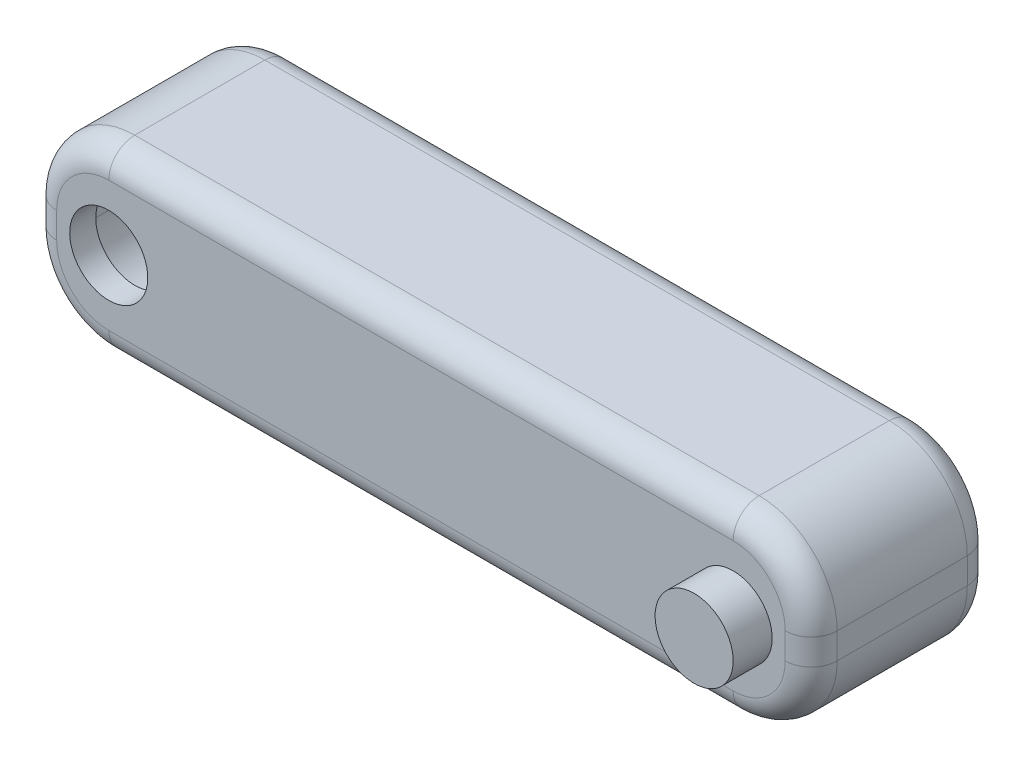
ISO-10303-21;
HEADER;
FILE_DESCRIPTION(('STEP AP214'),'2;1');
FILE_NAME('part.step','',(''),(''),'','','');
FILE_SCHEMA(('AUTOMOTIVE_DESIGN { 1 0 10303 214 1 1 1 1 }'));
ENDSEC;
DATA;
#1=APPLICATION_CONTEXT('core data for automotive mechanical design processes');
#2=APPLICATION_PROTOCOL_DEFINITION('international standard','automotive_design',2000,#1);
#3=PRODUCT_CONTEXT('',#1,'mechanical');
#4=PRODUCT('Part','Part','',(#3));
#5=PRODUCT_RELATED_PRODUCT_CATEGORY('part','',(#4));
#6=PRODUCT_DEFINITION_FORMATION('','',#4);
#7=PRODUCT_DEFINITION_CONTEXT('part definition',#1,'design');
#8=PRODUCT_DEFINITION('design','',#6,#7);
#9=PRODUCT_DEFINITION_SHAPE('','',#8);
#10=(LENGTH_UNIT() NAMED_UNIT(*) SI_UNIT(.MILLI.,.METRE.));
#11=(NAMED_UNIT(*) PLANE_ANGLE_UNIT() SI_UNIT($,.RADIAN.));
#12=(NAMED_UNIT(*) SI_UNIT($,.STERADIAN.) SOLID_ANGLE_UNIT());
#13=UNCERTAINTY_MEASURE_WITH_UNIT(LENGTH_MEASURE(1.E-05),#10,'distance_accuracy_value','');
#14=(GEOMETRIC_REPRESENTATION_CONTEXT(3) GLOBAL_UNCERTAINTY_ASSIGNED_CONTEXT((#13)) GLOBAL_UNIT_ASSIGNED_CONTEXT((#10,
#11,#12)) REPRESENTATION_CONTEXT('',''));
#15=CARTESIAN_POINT('',(0.,0.,0.));
#16=DIRECTION('',(0.,0.,1.));
#17=DIRECTION('',(1.,0.,0.));
#18=AXIS2_PLACEMENT_3D('',#15,#16,#17);
#19=CARTESIAN_POINT('',(300.,35.,35.));
#20=DIRECTION('',(0.,0.,-1.));
#21=DIRECTION('',(0.,1.,0.));
#22=AXIS2_PLACEMENT_3D('',#19,#20,#21);
#23=PLANE('',#22);
#24=CARTESIAN_POINT('',(270.,0.,35.));
#25=DIRECTION('',(0.,0.,-1.));
#26=DIRECTION('',(0.,1.,0.));
#27=AXIS2_PLACEMENT_3D('',#24,#25,#26);
#28=CIRCLE('',#27,15.);
#29=CARTESIAN_POINT('',(270.,15.,35.));
#30=VERTEX_POINT('',#29);
#31=EDGE_CURVE('E11',#30,#30,#28,.F.);
#32=ORIENTED_EDGE('',*,*,#31,.F.);
#33=EDGE_LOOP('',(#32));
#34=FACE_BOUND('',#33,.T.);
#35=CARTESIAN_POINT('',(30.,0.,35.));
#36=DIRECTION('',(0.,0.,-1.));
#37=DIRECTION('',(0.,1.,0.));
#38=AXIS2_PLACEMENT_3D('',#35,#36,#37);
#39=CIRCLE('',#38,15.);
#40=CARTESIAN_POINT('',(30.,15.,35.));
#41=VERTEX_POINT('',#40);
#42=EDGE_CURVE('E860',#41,#41,#39,.T.);
#43=ORIENTED_EDGE('',*,*,#42,.T.);
#44=EDGE_LOOP('',(#43));
#45=FACE_BOUND('',#44,.T.);
#46=DIRECTION('',(0.,-1.,0.));
#47=VECTOR('',#46,1.);
#48=CARTESIAN_POINT('',(290.,35.,35.));
#49=LINE('',#48,#47);
#50=CARTESIAN_POINT('',(290.,-5.,35.));
#51=VERTEX_POINT('',#50);
#52=CARTESIAN_POINT('',(290.,5.,35.));
#53=VERTEX_POINT('',#52);
#54=EDGE_CURVE('E111',#51,#53,#49,.F.);
#55=ORIENTED_EDGE('',*,*,#54,.T.);
#56=CARTESIAN_POINT('',(270.,5.,35.));
#57=DIRECTION('',(0.,0.,-1.));
#58=DIRECTION('',(0.,1.,0.));
#59=AXIS2_PLACEMENT_3D('',#56,#57,#58);
#60=CIRCLE('',#59,20.);
#61=CARTESIAN_POINT('',(270.,25.,35.));
#62=VERTEX_POINT('',#61);
#63=EDGE_CURVE('E293',#53,#62,#60,.F.);
#64=ORIENTED_EDGE('',*,*,#63,.T.);
#65=DIRECTION('',(-1.,0.,0.));
#66=VECTOR('',#65,1.);
#67=CARTESIAN_POINT('',(300.,25.,35.));
#68=LINE('',#67,#66);
#69=CARTESIAN_POINT('',(30.,25.,35.));
#70=VERTEX_POINT('',#69);
#71=EDGE_CURVE('E281',#62,#70,#68,.T.);
#72=ORIENTED_EDGE('',*,*,#71,.T.);
#73=CARTESIAN_POINT('',(30.,5.,35.));
#74=DIRECTION('',(0.,0.,-1.));
#75=DIRECTION('',(0.,1.,0.));
#76=AXIS2_PLACEMENT_3D('',#73,#74,#75);
#77=CIRCLE('',#76,20.);
#78=CARTESIAN_POINT('',(9.99999999999997,5.,35.));
#79=VERTEX_POINT('',#78);
#80=EDGE_CURVE('E283',#70,#79,#77,.F.);
#81=ORIENTED_EDGE('',*,*,#80,.T.);
#82=DIRECTION('',(0.,-1.,0.));
#83=VECTOR('',#82,1.);
#84=CARTESIAN_POINT('',(10.,-5.,35.));
#85=LINE('',#84,#83);
#86=CARTESIAN_POINT('',(10.,-5.,35.));
#87=VERTEX_POINT('',#86);
#88=EDGE_CURVE('E285',#79,#87,#85,.T.);
#89=ORIENTED_EDGE('',*,*,#88,.T.);
#90=CARTESIAN_POINT('',(30.,-5.,35.));
#91=DIRECTION('',(0.,0.,-1.));
#92=DIRECTION('',(0.,1.,0.));
#93=AXIS2_PLACEMENT_3D('',#90,#91,#92);
#94=CIRCLE('',#93,20.);
#95=CARTESIAN_POINT('',(30.,-25.,35.));
#96=VERTEX_POINT('',#95);
#97=EDGE_CURVE('E287',#87,#96,#94,.F.);
#98=ORIENTED_EDGE('',*,*,#97,.T.);
#99=DIRECTION('',(-1.,0.,0.));
#100=VECTOR('',#99,1.);
#101=CARTESIAN_POINT('',(300.,-25.,35.));
#102=LINE('',#101,#100);
#103=CARTESIAN_POINT('',(270.,-25.,35.));
#104=VERTEX_POINT('',#103);
#105=EDGE_CURVE('E289',#96,#104,#102,.F.);
#106=ORIENTED_EDGE('',*,*,#105,.T.);
#107=CARTESIAN_POINT('',(270.,-5.,35.));
#108=DIRECTION('',(0.,0.,-1.));
#109=DIRECTION('',(0.,1.,0.));
#110=AXIS2_PLACEMENT_3D('',#107,#108,#109);
#111=CIRCLE('',#110,20.);
#112=EDGE_CURVE('E116',#104,#51,#111,.F.);
#113=ORIENTED_EDGE('',*,*,#112,.T.);
#114=EDGE_LOOP('',(#55,#64,#72,#81,#89,#98,#106,#113));
#115=FACE_BOUND('',#114,.T.);
#116=ADVANCED_FACE('F35',(#34,#45,#115),#23,.F.);
#117=CARTESIAN_POINT('',(300.,-35.,-35.));
#118=DIRECTION('',(0.,1.,0.));
#119=DIRECTION('',(0.,0.,1.));
#120=AXIS2_PLACEMENT_3D('',#117,#118,#119);
#121=PLANE('',#120);
#122=DIRECTION('',(0.,0.,-1.));
#123=VECTOR('',#122,1.);
#124=CARTESIAN_POINT('',(30.,-35.,-35.));
#125=LINE('',#124,#123);
#126=CARTESIAN_POINT('',(30.,-35.,25.));
#127=VERTEX_POINT('',#126);
#128=CARTESIAN_POINT('',(30.,-35.,-25.));
#129=VERTEX_POINT('',#128);
#130=EDGE_CURVE('E844',#127,#129,#125,.T.);
#131=ORIENTED_EDGE('',*,*,#130,.T.);
#132=DIRECTION('',(-1.,0.,0.));
#133=VECTOR('',#132,1.);
#134=CARTESIAN_POINT('',(300.,-35.,-25.));
#135=LINE('',#134,#133);
#136=CARTESIAN_POINT('',(270.,-35.,-25.));
#137=VERTEX_POINT('',#136);
#138=EDGE_CURVE('E268',#129,#137,#135,.F.);
#139=ORIENTED_EDGE('',*,*,#138,.T.);
#140=DIRECTION('',(0.,0.,-1.));
#141=VECTOR('',#140,1.);
#142=CARTESIAN_POINT('',(270.,-35.,-35.));
#143=LINE('',#142,#141);
#144=CARTESIAN_POINT('',(270.,-35.,25.));
#145=VERTEX_POINT('',#144);
#146=EDGE_CURVE('E315',#137,#145,#143,.F.);
#147=ORIENTED_EDGE('',*,*,#146,.T.);
#148=DIRECTION('',(-1.,0.,0.));
#149=VECTOR('',#148,1.);
#150=CARTESIAN_POINT('',(300.,-35.,25.));
#151=LINE('',#150,#149);
#152=EDGE_CURVE('E266',#145,#127,#151,.T.);
#153=ORIENTED_EDGE('',*,*,#152,.T.);
#154=EDGE_LOOP('',(#131,#139,#147,#153));
#155=FACE_BOUND('',#154,.T.);
#156=ADVANCED_FACE('F432',(#155),#121,.F.);
#157=CARTESIAN_POINT('',(300.,35.,-35.));
#158=DIRECTION('',(0.,0.,1.));
#159=DIRECTION('',(0.,-1.,0.));
#160=AXIS2_PLACEMENT_3D('',#157,#158,#159);
#161=PLANE('',#160);
#162=DIRECTION('',(-1.,0.,0.));
#163=VECTOR('',#162,1.);
#164=CARTESIAN_POINT('',(300.,25.,-35.));
#165=LINE('',#164,#163);
#166=CARTESIAN_POINT('',(30.,25.,-35.));
#167=VERTEX_POINT('',#166);
#168=CARTESIAN_POINT('',(270.,25.,-35.));
#169=VERTEX_POINT('',#168);
#170=EDGE_CURVE('E213',#167,#169,#165,.F.);
#171=ORIENTED_EDGE('',*,*,#170,.T.);
#172=CARTESIAN_POINT('',(270.,5.00000000000001,-35.));
#173=DIRECTION('',(0.,0.,1.));
#174=DIRECTION('',(0.,-1.,0.));
#175=AXIS2_PLACEMENT_3D('',#172,#173,#174);
#176=CIRCLE('',#175,20.);
#177=CARTESIAN_POINT('',(290.,5.00000000000001,-35.));
#178=VERTEX_POINT('',#177);
#179=EDGE_CURVE('E250',#169,#178,#176,.F.);
#180=ORIENTED_EDGE('',*,*,#179,.T.);
#181=DIRECTION('',(0.,1.,0.));
#182=VECTOR('',#181,1.);
#183=CARTESIAN_POINT('',(290.,35.,-35.));
#184=LINE('',#183,#182);
#185=CARTESIAN_POINT('',(290.,-5.,-35.));
#186=VERTEX_POINT('',#185);
#187=EDGE_CURVE('E248',#178,#186,#184,.F.);
#188=ORIENTED_EDGE('',*,*,#187,.T.);
#189=CARTESIAN_POINT('',(270.,-5.,-35.));
#190=DIRECTION('',(0.,0.,1.));
#191=DIRECTION('',(0.,-1.,0.));
#192=AXIS2_PLACEMENT_3D('',#189,#190,#191);
#193=CIRCLE('',#192,20.);
#194=CARTESIAN_POINT('',(270.,-25.,-35.));
#195=VERTEX_POINT('',#194);
#196=EDGE_CURVE('E246',#186,#195,#193,.F.);
#197=ORIENTED_EDGE('',*,*,#196,.T.);
#198=DIRECTION('',(-1.,0.,0.));
#199=VECTOR('',#198,1.);
#200=CARTESIAN_POINT('',(300.,-25.,-35.));
#201=LINE('',#200,#199);
#202=CARTESIAN_POINT('',(30.,-25.,-35.));
#203=VERTEX_POINT('',#202);
#204=EDGE_CURVE('E244',#195,#203,#201,.T.);
#205=ORIENTED_EDGE('',*,*,#204,.T.);
#206=CARTESIAN_POINT('',(30.,-5.,-35.));
#207=DIRECTION('',(0.,0.,1.));
#208=DIRECTION('',(0.,-1.,0.));
#209=AXIS2_PLACEMENT_3D('',#206,#207,#208);
#210=CIRCLE('',#209,20.);
#211=CARTESIAN_POINT('',(10.,-5.,-35.));
#212=VERTEX_POINT('',#211);
#213=EDGE_CURVE('E242',#203,#212,#210,.F.);
#214=ORIENTED_EDGE('',*,*,#213,.T.);
#215=DIRECTION('',(0.,1.,0.));
#216=VECTOR('',#215,1.);
#217=CARTESIAN_POINT('',(10.,5.00000000000001,-35.));
#218=LINE('',#217,#216);
#219=CARTESIAN_POINT('',(9.99999999999997,5.00000000000001,-35.));
#220=VERTEX_POINT('',#219);
#221=EDGE_CURVE('E216',#212,#220,#218,.T.);
#222=ORIENTED_EDGE('',*,*,#221,.T.);
#223=CARTESIAN_POINT('',(30.,5.00000000000001,-35.));
#224=DIRECTION('',(0.,0.,1.));
#225=DIRECTION('',(0.,-1.,0.));
#226=AXIS2_PLACEMENT_3D('',#223,#224,#225);
#227=CIRCLE('',#226,20.);
#228=EDGE_CURVE('E208',#220,#167,#227,.F.);
#229=ORIENTED_EDGE('',*,*,#228,.T.);
#230=EDGE_LOOP('',(#171,#180,#188,#197,#205,#214,#222,#229));
#231=FACE_BOUND('',#230,.T.);
#232=ADVANCED_FACE('F210',(#231),#161,.F.);
#233=CARTESIAN_POINT('',(300.,35.,-35.));
#234=DIRECTION('',(0.,-1.,0.));
#235=DIRECTION('',(0.,0.,-1.));
#236=AXIS2_PLACEMENT_3D('',#233,#234,#235);
#237=PLANE('',#236);
#238=DIRECTION('',(0.,0.,1.));
#239=VECTOR('',#238,1.);
#240=CARTESIAN_POINT('',(270.,35.,-35.));
#241=LINE('',#240,#239);
#242=CARTESIAN_POINT('',(270.,35.,25.));
#243=VERTEX_POINT('',#242);
#244=CARTESIAN_POINT('',(270.,35.,-25.));
#245=VERTEX_POINT('',#244);
#246=EDGE_CURVE('E805',#243,#245,#241,.F.);
#247=ORIENTED_EDGE('',*,*,#246,.T.);
#248=DIRECTION('',(-1.,0.,0.));
#249=VECTOR('',#248,1.);
#250=CARTESIAN_POINT('',(300.,35.,-25.));
#251=LINE('',#250,#249);
#252=CARTESIAN_POINT('',(30.,35.,-25.));
#253=VERTEX_POINT('',#252);
#254=EDGE_CURVE('E297',#245,#253,#251,.T.);
#255=ORIENTED_EDGE('',*,*,#254,.T.);
#256=DIRECTION('',(0.,0.,1.));
#257=VECTOR('',#256,1.);
#258=CARTESIAN_POINT('',(30.,35.,35.));
#259=LINE('',#258,#257);
#260=CARTESIAN_POINT('',(30.,35.,25.));
#261=VERTEX_POINT('',#260);
#262=EDGE_CURVE('E810',#253,#261,#259,.T.);
#263=ORIENTED_EDGE('',*,*,#262,.T.);
#264=DIRECTION('',(-1.,0.,0.));
#265=VECTOR('',#264,1.);
#266=CARTESIAN_POINT('',(300.,35.,25.));
#267=LINE('',#266,#265);
#268=EDGE_CURVE('E295',#261,#243,#267,.F.);
#269=ORIENTED_EDGE('',*,*,#268,.T.);
#270=EDGE_LOOP('',(#247,#255,#263,#269));
#271=FACE_BOUND('',#270,.T.);
#272=ADVANCED_FACE('F757',(#271),#237,.F.);
#273=CARTESIAN_POINT('',(300.,0.,0.));
#274=DIRECTION('',(-1.,0.,0.));
#275=DIRECTION('',(0.,0.,1.));
#276=AXIS2_PLACEMENT_3D('',#273,#274,#275);
#277=PLANE('',#276);
#278=DIRECTION('',(0.,0.,-1.));
#279=VECTOR('',#278,1.);
#280=CARTESIAN_POINT('',(300.,-5.,0.));
#281=LINE('',#280,#279);
#282=CARTESIAN_POINT('',(300.,-5.,25.));
#283=VERTEX_POINT('',#282);
#284=CARTESIAN_POINT('',(300.,-5.,-25.));
#285=VERTEX_POINT('',#284);
#286=EDGE_CURVE('E234',#283,#285,#281,.T.);
#287=ORIENTED_EDGE('',*,*,#286,.T.);
#288=DIRECTION('',(0.,1.,0.));
#289=VECTOR('',#288,1.);
#290=CARTESIAN_POINT('',(300.,0.,-25.));
#291=LINE('',#290,#289);
#292=CARTESIAN_POINT('',(300.,5.00000000000001,-25.));
#293=VERTEX_POINT('',#292);
#294=EDGE_CURVE('E260',#285,#293,#291,.T.);
#295=ORIENTED_EDGE('',*,*,#294,.T.);
#296=DIRECTION('',(0.,0.,1.));
#297=VECTOR('',#296,1.);
#298=CARTESIAN_POINT('',(300.,5.00000000000001,0.));
#299=LINE('',#298,#297);
#300=CARTESIAN_POINT('',(300.,5.00000000000001,25.));
#301=VERTEX_POINT('',#300);
#302=EDGE_CURVE('E237',#293,#301,#299,.T.);
#303=ORIENTED_EDGE('',*,*,#302,.T.);
#304=DIRECTION('',(0.,-1.,0.));
#305=VECTOR('',#304,1.);
#306=CARTESIAN_POINT('',(300.,0.,25.));
#307=LINE('',#306,#305);
#308=EDGE_CURVE('E258',#301,#283,#307,.T.);
#309=ORIENTED_EDGE('',*,*,#308,.T.);
#310=EDGE_LOOP('',(#287,#295,#303,#309));
#311=FACE_BOUND('',#310,.T.);
#312=ADVANCED_FACE('F748',(#311),#277,.F.);
#313=CARTESIAN_POINT('',(0.,0.,0.));
#314=DIRECTION('',(-1.,0.,0.));
#315=DIRECTION('',(0.,0.,1.));
#316=AXIS2_PLACEMENT_3D('',#313,#314,#315);
#317=PLANE('',#316);
#318=DIRECTION('',(0.,0.,1.));
#319=VECTOR('',#318,1.);
#320=CARTESIAN_POINT('',(0.,5.00000000000001,-35.));
#321=LINE('',#320,#319);
#322=CARTESIAN_POINT('',(0.,5.00000000000001,25.));
#323=VERTEX_POINT('',#322);
#324=CARTESIAN_POINT('',(0.,5.00000000000001,-25.));
#325=VERTEX_POINT('',#324);
#326=EDGE_CURVE('E815',#323,#325,#321,.F.);
#327=ORIENTED_EDGE('',*,*,#326,.T.);
#328=DIRECTION('',(0.,1.,0.));
#329=VECTOR('',#328,1.);
#330=CARTESIAN_POINT('',(0.,-5.,-25.));
#331=LINE('',#330,#329);
#332=CARTESIAN_POINT('',(0.,-5.,-25.));
#333=VERTEX_POINT('',#332);
#334=EDGE_CURVE('E276',#325,#333,#331,.F.);
#335=ORIENTED_EDGE('',*,*,#334,.T.);
#336=DIRECTION('',(0.,0.,-1.));
#337=VECTOR('',#336,1.);
#338=CARTESIAN_POINT('',(0.,-5.,35.));
#339=LINE('',#338,#337);
#340=CARTESIAN_POINT('',(0.,-5.,25.));
#341=VERTEX_POINT('',#340);
#342=EDGE_CURVE('E811',#333,#341,#339,.F.);
#343=ORIENTED_EDGE('',*,*,#342,.T.);
#344=DIRECTION('',(0.,-1.,0.));
#345=VECTOR('',#344,1.);
#346=CARTESIAN_POINT('',(0.,5.00000000000001,25.));
#347=LINE('',#346,#345);
#348=EDGE_CURVE('E274',#341,#323,#347,.F.);
#349=ORIENTED_EDGE('',*,*,#348,.T.);
#350=EDGE_LOOP('',(#327,#335,#343,#349));
#351=FACE_BOUND('',#350,.T.);
#352=ADVANCED_FACE('F448',(#351),#317,.T.);
#353=CARTESIAN_POINT('',(30.,-5.,-35.));
#354=DIRECTION('',(0.,0.,1.));
#355=DIRECTION('',(1.,0.,0.));
#356=AXIS2_PLACEMENT_3D('',#353,#354,#355);
#357=CYLINDRICAL_SURFACE('',#356,30.);
#358=ORIENTED_EDGE('',*,*,#342,.F.);
#359=CARTESIAN_POINT('',(30.,-5.,-25.));
#360=DIRECTION('',(0.,0.,1.));
#361=DIRECTION('',(0.,-1.,0.));
#362=AXIS2_PLACEMENT_3D('',#359,#360,#361);
#363=CIRCLE('',#362,30.);
#364=EDGE_CURVE('E272',#333,#129,#363,.T.);
#365=ORIENTED_EDGE('',*,*,#364,.T.);
#366=ORIENTED_EDGE('',*,*,#130,.F.);
#367=CARTESIAN_POINT('',(30.,-5.,25.));
#368=DIRECTION('',(0.,0.,-1.));
#369=DIRECTION('',(0.,1.,0.));
#370=AXIS2_PLACEMENT_3D('',#367,#368,#369);
#371=CIRCLE('',#370,30.);
#372=EDGE_CURVE('E270',#127,#341,#371,.T.);
#373=ORIENTED_EDGE('',*,*,#372,.T.);
#374=EDGE_LOOP('',(#358,#365,#366,#373));
#375=FACE_BOUND('',#374,.T.);
#376=ADVANCED_FACE('F444',(#375),#357,.T.);
#377=CARTESIAN_POINT('',(30.,5.00000000000001,-35.));
#378=DIRECTION('',(0.,0.,-1.));
#379=DIRECTION('',(0.,1.,0.));
#380=AXIS2_PLACEMENT_3D('',#377,#378,#379);
#381=CYLINDRICAL_SURFACE('',#380,30.);
#382=ORIENTED_EDGE('',*,*,#262,.F.);
#383=CARTESIAN_POINT('',(30.,5.00000000000001,-25.));
#384=DIRECTION('',(0.,0.,1.));
#385=DIRECTION('',(0.,-1.,0.));
#386=AXIS2_PLACEMENT_3D('',#383,#384,#385);
#387=CIRCLE('',#386,30.);
#388=EDGE_CURVE('E225',#253,#325,#387,.T.);
#389=ORIENTED_EDGE('',*,*,#388,.T.);
#390=ORIENTED_EDGE('',*,*,#326,.F.);
#391=CARTESIAN_POINT('',(30.,5.00000000000001,25.));
#392=DIRECTION('',(0.,0.,-1.));
#393=DIRECTION('',(0.,1.,0.));
#394=AXIS2_PLACEMENT_3D('',#391,#392,#393);
#395=CIRCLE('',#394,30.);
#396=EDGE_CURVE('E278',#323,#261,#395,.T.);
#397=ORIENTED_EDGE('',*,*,#396,.T.);
#398=EDGE_LOOP('',(#382,#389,#390,#397));
#399=FACE_BOUND('',#398,.T.);
#400=ADVANCED_FACE('F447',(#399),#381,.T.);
#401=CARTESIAN_POINT('',(270.,-5.,0.));
#402=DIRECTION('',(0.,0.,-1.));
#403=DIRECTION('',(-1.,0.,0.));
#404=AXIS2_PLACEMENT_3D('',#401,#402,#403);
#405=CYLINDRICAL_SURFACE('',#404,30.);
#406=ORIENTED_EDGE('',*,*,#146,.F.);
#407=CARTESIAN_POINT('',(270.,-5.,-25.));
#408=DIRECTION('',(0.,0.,1.));
#409=DIRECTION('',(0.,-1.,0.));
#410=AXIS2_PLACEMENT_3D('',#407,#408,#409);
#411=CIRCLE('',#410,30.);
#412=EDGE_CURVE('E264',#137,#285,#411,.T.);
#413=ORIENTED_EDGE('',*,*,#412,.T.);
#414=ORIENTED_EDGE('',*,*,#286,.F.);
#415=CARTESIAN_POINT('',(270.,-5.,25.));
#416=DIRECTION('',(0.,0.,-1.));
#417=DIRECTION('',(0.,1.,0.));
#418=AXIS2_PLACEMENT_3D('',#415,#416,#417);
#419=CIRCLE('',#418,30.);
#420=EDGE_CURVE('E262',#283,#145,#419,.T.);
#421=ORIENTED_EDGE('',*,*,#420,.T.);
#422=EDGE_LOOP('',(#406,#413,#414,#421));
#423=FACE_BOUND('',#422,.T.);
#424=ADVANCED_FACE('F452',(#423),#405,.T.);
#425=CARTESIAN_POINT('',(270.,5.00000000000001,0.));
#426=DIRECTION('',(0.,0.,1.));
#427=DIRECTION('',(0.,-1.,0.));
#428=AXIS2_PLACEMENT_3D('',#425,#426,#427);
#429=CYLINDRICAL_SURFACE('',#428,30.);
#430=ORIENTED_EDGE('',*,*,#302,.F.);
#431=CARTESIAN_POINT('',(270.,5.00000000000001,-25.));
#432=DIRECTION('',(0.,0.,1.));
#433=DIRECTION('',(0.,-1.,0.));
#434=AXIS2_PLACEMENT_3D('',#431,#432,#433);
#435=CIRCLE('',#434,30.);
#436=EDGE_CURVE('E255',#293,#245,#435,.T.);
#437=ORIENTED_EDGE('',*,*,#436,.T.);
#438=ORIENTED_EDGE('',*,*,#246,.F.);
#439=CARTESIAN_POINT('',(270.,5.00000000000001,25.));
#440=DIRECTION('',(0.,0.,-1.));
#441=DIRECTION('',(0.,1.,0.));
#442=AXIS2_PLACEMENT_3D('',#439,#440,#441);
#443=CIRCLE('',#442,30.);
#444=EDGE_CURVE('E252',#243,#301,#443,.T.);
#445=ORIENTED_EDGE('',*,*,#444,.T.);
#446=EDGE_LOOP('',(#430,#437,#438,#445));
#447=FACE_BOUND('',#446,.T.);
#448=ADVANCED_FACE('F456',(#447),#429,.T.);
#449=CARTESIAN_POINT('',(30.,-5.,-25.));
#450=DIRECTION('',(0.,0.,1.));
#451=DIRECTION('',(0.,-1.,0.));
#452=AXIS2_PLACEMENT_3D('',#449,#450,#451);
#453=TOROIDAL_SURFACE('',#452,20.,10.);
#454=CARTESIAN_POINT('',(30.,-25.,-25.));
#455=DIRECTION('',(1.,0.,0.));
#456=DIRECTION('',(0.,0.,-1.));
#457=AXIS2_PLACEMENT_3D('',#454,#455,#456);
#458=CIRCLE('',#457,10.);
#459=EDGE_CURVE('E309',#129,#203,#458,.T.);
#460=ORIENTED_EDGE('',*,*,#459,.F.);
#461=ORIENTED_EDGE('',*,*,#364,.F.);
#462=CARTESIAN_POINT('',(9.99999999999997,-5.,-25.));
#463=DIRECTION('',(0.,1.,0.));
#464=DIRECTION('',(0.,0.,1.));
#465=AXIS2_PLACEMENT_3D('',#462,#463,#464);
#466=CIRCLE('',#465,10.);
#467=EDGE_CURVE('E312',#212,#333,#466,.T.);
#468=ORIENTED_EDGE('',*,*,#467,.F.);
#469=ORIENTED_EDGE('',*,*,#213,.F.);
#470=EDGE_LOOP('',(#460,#461,#468,#469));
#471=FACE_BOUND('',#470,.T.);
#472=ADVANCED_FACE('F460',(#471),#453,.T.);
#473=CARTESIAN_POINT('',(10.,35.,-25.));
#474=DIRECTION('',(0.,-1.,0.));
#475=DIRECTION('',(0.,0.,-1.));
#476=AXIS2_PLACEMENT_3D('',#473,#474,#475);
#477=CYLINDRICAL_SURFACE('',#476,10.);
#478=ORIENTED_EDGE('',*,*,#467,.T.);
#479=ORIENTED_EDGE('',*,*,#334,.F.);
#480=CARTESIAN_POINT('',(10.,5.00000000000001,-25.));
#481=DIRECTION('',(0.,1.,0.));
#482=DIRECTION('',(0.,0.,1.));
#483=AXIS2_PLACEMENT_3D('',#480,#481,#482);
#484=CIRCLE('',#483,10.);
#485=EDGE_CURVE('E307',#220,#325,#484,.T.);
#486=ORIENTED_EDGE('',*,*,#485,.F.);
#487=ORIENTED_EDGE('',*,*,#221,.F.);
#488=EDGE_LOOP('',(#478,#479,#486,#487));
#489=FACE_BOUND('',#488,.T.);
#490=ADVANCED_FACE('F482',(#489),#477,.T.);
#491=CARTESIAN_POINT('',(300.,-25.,-25.));
#492=DIRECTION('',(-1.,0.,0.));
#493=DIRECTION('',(0.,0.,1.));
#494=AXIS2_PLACEMENT_3D('',#491,#492,#493);
#495=CYLINDRICAL_SURFACE('',#494,10.);
#496=ORIENTED_EDGE('',*,*,#459,.T.);
#497=ORIENTED_EDGE('',*,*,#204,.F.);
#498=CARTESIAN_POINT('',(270.,-25.,-25.));
#499=DIRECTION('',(1.,0.,0.));
#500=DIRECTION('',(0.,0.,-1.));
#501=AXIS2_PLACEMENT_3D('',#498,#499,#500);
#502=CIRCLE('',#501,10.);
#503=EDGE_CURVE('E228',#137,#195,#502,.T.);
#504=ORIENTED_EDGE('',*,*,#503,.F.);
#505=ORIENTED_EDGE('',*,*,#138,.F.);
#506=EDGE_LOOP('',(#496,#497,#504,#505));
#507=FACE_BOUND('',#506,.T.);
#508=ADVANCED_FACE('F479',(#507),#495,.T.);
#509=CARTESIAN_POINT('',(30.,5.00000000000001,-25.));
#510=DIRECTION('',(0.,0.,1.));
#511=DIRECTION('',(0.,-1.,0.));
#512=AXIS2_PLACEMENT_3D('',#509,#510,#511);
#513=TOROIDAL_SURFACE('',#512,20.,10.);
#514=ORIENTED_EDGE('',*,*,#485,.T.);
#515=ORIENTED_EDGE('',*,*,#388,.F.);
#516=CARTESIAN_POINT('',(30.,25.,-25.));
#517=DIRECTION('',(1.,0.,0.));
#518=DIRECTION('',(0.,0.,-1.));
#519=AXIS2_PLACEMENT_3D('',#516,#517,#518);
#520=CIRCLE('',#519,10.);
#521=EDGE_CURVE('E223',#167,#253,#520,.T.);
#522=ORIENTED_EDGE('',*,*,#521,.F.);
#523=ORIENTED_EDGE('',*,*,#228,.F.);
#524=EDGE_LOOP('',(#514,#515,#522,#523));
#525=FACE_BOUND('',#524,.T.);
#526=ADVANCED_FACE('F224',(#525),#513,.T.);
#527=CARTESIAN_POINT('',(270.,-5.,-25.));
#528=DIRECTION('',(0.,0.,1.));
#529=DIRECTION('',(0.,-1.,0.));
#530=AXIS2_PLACEMENT_3D('',#527,#528,#529);
#531=TOROIDAL_SURFACE('',#530,20.,10.);
#532=ORIENTED_EDGE('',*,*,#503,.T.);
#533=ORIENTED_EDGE('',*,*,#196,.F.);
#534=CARTESIAN_POINT('',(290.,-5.,-25.));
#535=DIRECTION('',(0.,1.,0.));
#536=DIRECTION('',(0.,0.,1.));
#537=AXIS2_PLACEMENT_3D('',#534,#535,#536);
#538=CIRCLE('',#537,10.);
#539=EDGE_CURVE('E229',#285,#186,#538,.T.);
#540=ORIENTED_EDGE('',*,*,#539,.F.);
#541=ORIENTED_EDGE('',*,*,#412,.F.);
#542=EDGE_LOOP('',(#532,#533,#540,#541));
#543=FACE_BOUND('',#542,.T.);
#544=ADVANCED_FACE('F473',(#543),#531,.T.);
#545=CARTESIAN_POINT('',(300.,25.,-25.));
#546=DIRECTION('',(-1.,0.,0.));
#547=DIRECTION('',(0.,0.,1.));
#548=AXIS2_PLACEMENT_3D('',#545,#546,#547);
#549=CYLINDRICAL_SURFACE('',#548,10.);
#550=ORIENTED_EDGE('',*,*,#521,.T.);
#551=ORIENTED_EDGE('',*,*,#254,.F.);
#552=CARTESIAN_POINT('',(270.,25.,-25.));
#553=DIRECTION('',(1.,0.,0.));
#554=DIRECTION('',(0.,0.,-1.));
#555=AXIS2_PLACEMENT_3D('',#552,#553,#554);
#556=CIRCLE('',#555,10.);
#557=EDGE_CURVE('E232',#169,#245,#556,.T.);
#558=ORIENTED_EDGE('',*,*,#557,.F.);
#559=ORIENTED_EDGE('',*,*,#170,.F.);
#560=EDGE_LOOP('',(#550,#551,#558,#559));
#561=FACE_BOUND('',#560,.T.);
#562=ADVANCED_FACE('F231',(#561),#549,.T.);
#563=CARTESIAN_POINT('',(290.,0.,-25.));
#564=DIRECTION('',(0.,1.,0.));
#565=DIRECTION('',(0.,0.,1.));
#566=AXIS2_PLACEMENT_3D('',#563,#564,#565);
#567=CYLINDRICAL_SURFACE('',#566,10.);
#568=ORIENTED_EDGE('',*,*,#539,.T.);
#569=ORIENTED_EDGE('',*,*,#187,.F.);
#570=CARTESIAN_POINT('',(290.,5.00000000000001,-25.));
#571=DIRECTION('',(0.,1.,0.));
#572=DIRECTION('',(0.,0.,1.));
#573=AXIS2_PLACEMENT_3D('',#570,#571,#572);
#574=CIRCLE('',#573,10.);
#575=EDGE_CURVE('E299',#293,#178,#574,.T.);
#576=ORIENTED_EDGE('',*,*,#575,.F.);
#577=ORIENTED_EDGE('',*,*,#294,.F.);
#578=EDGE_LOOP('',(#568,#569,#576,#577));
#579=FACE_BOUND('',#578,.T.);
#580=ADVANCED_FACE('F466',(#579),#567,.T.);
#581=CARTESIAN_POINT('',(270.,5.00000000000001,-25.));
#582=DIRECTION('',(0.,0.,1.));
#583=DIRECTION('',(0.,-1.,0.));
#584=AXIS2_PLACEMENT_3D('',#581,#582,#583);
#585=TOROIDAL_SURFACE('',#584,20.,10.);
#586=ORIENTED_EDGE('',*,*,#557,.T.);
#587=ORIENTED_EDGE('',*,*,#436,.F.);
#588=ORIENTED_EDGE('',*,*,#575,.T.);
#589=ORIENTED_EDGE('',*,*,#179,.F.);
#590=EDGE_LOOP('',(#586,#587,#588,#589));
#591=FACE_BOUND('',#590,.T.);
#592=ADVANCED_FACE('F462',(#591),#585,.T.);
#593=CARTESIAN_POINT('',(30.,-5.,25.));
#594=DIRECTION('',(0.,0.,-1.));
#595=DIRECTION('',(0.,1.,0.));
#596=AXIS2_PLACEMENT_3D('',#593,#594,#595);
#597=TOROIDAL_SURFACE('',#596,20.,10.);
#598=CARTESIAN_POINT('',(9.99999999999997,-5.,25.));
#599=DIRECTION('',(0.,1.,0.));
#600=DIRECTION('',(0.,0.,1.));
#601=AXIS2_PLACEMENT_3D('',#598,#599,#600);
#602=CIRCLE('',#601,10.);
#603=EDGE_CURVE('E333',#341,#87,#602,.T.);
#604=ORIENTED_EDGE('',*,*,#603,.F.);
#605=ORIENTED_EDGE('',*,*,#372,.F.);
#606=CARTESIAN_POINT('',(30.,-25.,25.));
#607=DIRECTION('',(1.,0.,0.));
#608=DIRECTION('',(0.,0.,-1.));
#609=AXIS2_PLACEMENT_3D('',#606,#607,#608);
#610=CIRCLE('',#609,10.);
#611=EDGE_CURVE('E301',#96,#127,#610,.T.);
#612=ORIENTED_EDGE('',*,*,#611,.F.);
#613=ORIENTED_EDGE('',*,*,#97,.F.);
#614=EDGE_LOOP('',(#604,#605,#612,#613));
#615=FACE_BOUND('',#614,.T.);
#616=ADVANCED_FACE('F465',(#615),#597,.T.);
#617=CARTESIAN_POINT('',(300.,-25.,25.));
#618=DIRECTION('',(-1.,0.,0.));
#619=DIRECTION('',(0.,0.,1.));
#620=AXIS2_PLACEMENT_3D('',#617,#618,#619);
#621=CYLINDRICAL_SURFACE('',#620,10.);
#622=ORIENTED_EDGE('',*,*,#611,.T.);
#623=ORIENTED_EDGE('',*,*,#152,.F.);
#624=CARTESIAN_POINT('',(270.,-25.,25.));
#625=DIRECTION('',(1.,0.,0.));
#626=DIRECTION('',(0.,0.,-1.));
#627=AXIS2_PLACEMENT_3D('',#624,#625,#626);
#628=CIRCLE('',#627,10.);
#629=EDGE_CURVE('E330',#104,#145,#628,.T.);
#630=ORIENTED_EDGE('',*,*,#629,.F.);
#631=ORIENTED_EDGE('',*,*,#105,.F.);
#632=EDGE_LOOP('',(#622,#623,#630,#631));
#633=FACE_BOUND('',#632,.T.);
#634=ADVANCED_FACE('F514',(#633),#621,.T.);
#635=CARTESIAN_POINT('',(10.,35.,25.));
#636=DIRECTION('',(0.,1.,0.));
#637=DIRECTION('',(0.,0.,1.));
#638=AXIS2_PLACEMENT_3D('',#635,#636,#637);
#639=CYLINDRICAL_SURFACE('',#638,10.);
#640=ORIENTED_EDGE('',*,*,#603,.T.);
#641=ORIENTED_EDGE('',*,*,#88,.F.);
#642=CARTESIAN_POINT('',(10.,5.00000000000001,25.));
#643=DIRECTION('',(0.,1.,0.));
#644=DIRECTION('',(0.,0.,1.));
#645=AXIS2_PLACEMENT_3D('',#642,#643,#644);
#646=CIRCLE('',#645,10.);
#647=EDGE_CURVE('E327',#323,#79,#646,.T.);
#648=ORIENTED_EDGE('',*,*,#647,.F.);
#649=ORIENTED_EDGE('',*,*,#348,.F.);
#650=EDGE_LOOP('',(#640,#641,#648,#649));
#651=FACE_BOUND('',#650,.T.);
#652=ADVANCED_FACE('F510',(#651),#639,.T.);
#653=CARTESIAN_POINT('',(270.,-5.,25.));
#654=DIRECTION('',(0.,0.,-1.));
#655=DIRECTION('',(0.,1.,0.));
#656=AXIS2_PLACEMENT_3D('',#653,#654,#655);
#657=TOROIDAL_SURFACE('',#656,20.,10.);
#658=ORIENTED_EDGE('',*,*,#629,.T.);
#659=ORIENTED_EDGE('',*,*,#420,.F.);
#660=CARTESIAN_POINT('',(290.,-5.,25.));
#661=DIRECTION('',(0.,1.,0.));
#662=DIRECTION('',(0.,0.,1.));
#663=AXIS2_PLACEMENT_3D('',#660,#661,#662);
#664=CIRCLE('',#663,10.);
#665=EDGE_CURVE('E324',#51,#283,#664,.T.);
#666=ORIENTED_EDGE('',*,*,#665,.F.);
#667=ORIENTED_EDGE('',*,*,#112,.F.);
#668=EDGE_LOOP('',(#658,#659,#666,#667));
#669=FACE_BOUND('',#668,.T.);
#670=ADVANCED_FACE('F506',(#669),#657,.T.);
#671=CARTESIAN_POINT('',(30.,5.00000000000001,25.));
#672=DIRECTION('',(0.,0.,-1.));
#673=DIRECTION('',(0.,1.,0.));
#674=AXIS2_PLACEMENT_3D('',#671,#672,#673);
#675=TOROIDAL_SURFACE('',#674,20.,10.);
#676=ORIENTED_EDGE('',*,*,#647,.T.);
#677=ORIENTED_EDGE('',*,*,#80,.F.);
#678=CARTESIAN_POINT('',(30.,25.,25.));
#679=DIRECTION('',(1.,0.,0.));
#680=DIRECTION('',(0.,0.,-1.));
#681=AXIS2_PLACEMENT_3D('',#678,#679,#680);
#682=CIRCLE('',#681,10.);
#683=EDGE_CURVE('E321',#261,#70,#682,.T.);
#684=ORIENTED_EDGE('',*,*,#683,.F.);
#685=ORIENTED_EDGE('',*,*,#396,.F.);
#686=EDGE_LOOP('',(#676,#677,#684,#685));
#687=FACE_BOUND('',#686,.T.);
#688=ADVANCED_FACE('F502',(#687),#675,.T.);
#689=CARTESIAN_POINT('',(290.,0.,25.));
#690=DIRECTION('',(0.,-1.,0.));
#691=DIRECTION('',(0.,0.,-1.));
#692=AXIS2_PLACEMENT_3D('',#689,#690,#691);
#693=CYLINDRICAL_SURFACE('',#692,10.);
#694=ORIENTED_EDGE('',*,*,#665,.T.);
#695=ORIENTED_EDGE('',*,*,#308,.F.);
#696=CARTESIAN_POINT('',(290.,5.00000000000001,25.));
#697=DIRECTION('',(0.,1.,0.));
#698=DIRECTION('',(0.,0.,1.));
#699=AXIS2_PLACEMENT_3D('',#696,#697,#698);
#700=CIRCLE('',#699,10.);
#701=EDGE_CURVE('E318',#53,#301,#700,.T.);
#702=ORIENTED_EDGE('',*,*,#701,.F.);
#703=ORIENTED_EDGE('',*,*,#54,.F.);
#704=EDGE_LOOP('',(#694,#695,#702,#703));
#705=FACE_BOUND('',#704,.T.);
#706=ADVANCED_FACE('F498',(#705),#693,.T.);
#707=CARTESIAN_POINT('',(300.,25.,25.));
#708=DIRECTION('',(-1.,0.,0.));
#709=DIRECTION('',(0.,0.,1.));
#710=AXIS2_PLACEMENT_3D('',#707,#708,#709);
#711=CYLINDRICAL_SURFACE('',#710,10.);
#712=ORIENTED_EDGE('',*,*,#683,.T.);
#713=ORIENTED_EDGE('',*,*,#71,.F.);
#714=CARTESIAN_POINT('',(270.,25.,25.));
#715=DIRECTION('',(1.,0.,0.));
#716=DIRECTION('',(0.,0.,-1.));
#717=AXIS2_PLACEMENT_3D('',#714,#715,#716);
#718=CIRCLE('',#717,10.);
#719=EDGE_CURVE('E316',#243,#62,#718,.T.);
#720=ORIENTED_EDGE('',*,*,#719,.F.);
#721=ORIENTED_EDGE('',*,*,#268,.F.);
#722=EDGE_LOOP('',(#712,#713,#720,#721));
#723=FACE_BOUND('',#722,.T.);
#724=ADVANCED_FACE('F494',(#723),#711,.T.);
#725=CARTESIAN_POINT('',(270.,5.00000000000001,25.));
#726=DIRECTION('',(0.,0.,-1.));
#727=DIRECTION('',(0.,1.,0.));
#728=AXIS2_PLACEMENT_3D('',#725,#726,#727);
#729=TOROIDAL_SURFACE('',#728,20.,10.);
#730=ORIENTED_EDGE('',*,*,#701,.T.);
#731=ORIENTED_EDGE('',*,*,#444,.F.);
#732=ORIENTED_EDGE('',*,*,#719,.T.);
#733=ORIENTED_EDGE('',*,*,#63,.F.);
#734=EDGE_LOOP('',(#730,#731,#732,#733));
#735=FACE_BOUND('',#734,.T.);
#736=ADVANCED_FACE('F490',(#735),#729,.T.);
#737=CARTESIAN_POINT('',(270.,0.,50.));
#738=DIRECTION('',(0.,0.,-1.));
#739=DIRECTION('',(-1.,0.,0.));
#740=AXIS2_PLACEMENT_3D('',#737,#738,#739);
#741=CYLINDRICAL_SURFACE('',#740,15.);
#742=CARTESIAN_POINT('',(270.,0.,50.));
#743=DIRECTION('',(0.,0.,1.));
#744=DIRECTION('',(1.,0.,0.));
#745=AXIS2_PLACEMENT_3D('',#742,#743,#744);
#746=CIRCLE('',#745,15.);
#747=CARTESIAN_POINT('',(285.,0.,50.));
#748=VERTEX_POINT('',#747);
#749=EDGE_CURVE('E319',#748,#748,#746,.T.);
#750=ORIENTED_EDGE('',*,*,#749,.F.);
#751=EDGE_LOOP('',(#750));
#752=FACE_BOUND('',#751,.T.);
#753=ORIENTED_EDGE('',*,*,#31,.T.);
#754=EDGE_LOOP('',(#753));
#755=FACE_BOUND('',#754,.T.);
#756=ADVANCED_FACE('F493',(#752,#755),#741,.T.);
#757=CARTESIAN_POINT('',(270.,0.,50.));
#758=DIRECTION('',(0.,0.,1.));
#759=DIRECTION('',(1.,0.,0.));
#760=AXIS2_PLACEMENT_3D('',#757,#758,#759);
#761=PLANE('',#760);
#762=ORIENTED_EDGE('',*,*,#749,.T.);
#763=EDGE_LOOP('',(#762));
#764=FACE_BOUND('',#763,.T.);
#765=ADVANCED_FACE('F599',(#764),#761,.T.);
#766=CARTESIAN_POINT('',(30.,0.,20.));
#767=DIRECTION('',(0.,0.,1.));
#768=DIRECTION('',(1.,0.,0.));
#769=AXIS2_PLACEMENT_3D('',#766,#767,#768);
#770=CYLINDRICAL_SURFACE('',#769,15.);
#771=CARTESIAN_POINT('',(30.,0.,25.));
#772=DIRECTION('',(0.,0.,-1.));
#773=DIRECTION('',(0.,1.,0.));
#774=AXIS2_PLACEMENT_3D('',#771,#772,#773);
#775=CIRCLE('',#774,15.);
#776=CARTESIAN_POINT('',(30.,15.,25.));
#777=VERTEX_POINT('',#776);
#778=EDGE_CURVE('E39',#777,#777,#775,.T.);
#779=ORIENTED_EDGE('',*,*,#778,.T.);
#780=EDGE_LOOP('',(#779));
#781=FACE_BOUND('',#780,.T.);
#782=ORIENTED_EDGE('',*,*,#42,.F.);
#783=EDGE_LOOP('',(#782));
#784=FACE_BOUND('',#783,.T.);
#785=ADVANCED_FACE('F524',(#781,#784),#770,.F.);
#786=CARTESIAN_POINT('',(300.,35.,25.));
#787=DIRECTION('',(0.,0.,-1.));
#788=DIRECTION('',(0.,1.,0.));
#789=AXIS2_PLACEMENT_3D('',#786,#787,#788);
#790=PLANE('',#789);
#791=ORIENTED_EDGE('',*,*,#778,.F.);
#792=EDGE_LOOP('',(#791));
#793=FACE_BOUND('',#792,.T.);
#794=DIRECTION('',(0.,-1.,0.));
#795=VECTOR('',#794,1.);
#796=CARTESIAN_POINT('',(290.,0.,25.));
#797=LINE('',#796,#795);
#798=CARTESIAN_POINT('',(290.,5.00000000000001,25.));
#799=VERTEX_POINT('',#798);
#800=CARTESIAN_POINT('',(290.,-5.,25.));
#801=VERTEX_POINT('',#800);
#802=EDGE_CURVE('E362',#799,#801,#797,.T.);
#803=ORIENTED_EDGE('',*,*,#802,.T.);
#804=CARTESIAN_POINT('',(270.,-5.,25.));
#805=DIRECTION('',(0.,0.,-1.));
#806=DIRECTION('',(0.,1.,0.));
#807=AXIS2_PLACEMENT_3D('',#804,#805,#806);
#808=CIRCLE('',#807,20.);
#809=CARTESIAN_POINT('',(270.,-25.,25.));
#810=VERTEX_POINT('',#809);
#811=EDGE_CURVE('E342',#801,#810,#808,.T.);
#812=ORIENTED_EDGE('',*,*,#811,.T.);
#813=DIRECTION('',(-1.,0.,0.));
#814=VECTOR('',#813,1.);
#815=CARTESIAN_POINT('',(300.,-25.,25.));
#816=LINE('',#815,#814);
#817=CARTESIAN_POINT('',(30.,-25.,25.));
#818=VERTEX_POINT('',#817);
#819=EDGE_CURVE('E381',#810,#818,#816,.T.);
#820=ORIENTED_EDGE('',*,*,#819,.T.);
#821=CARTESIAN_POINT('',(30.,-5.,25.));
#822=DIRECTION('',(0.,0.,-1.));
#823=DIRECTION('',(0.,1.,0.));
#824=AXIS2_PLACEMENT_3D('',#821,#822,#823);
#825=CIRCLE('',#824,20.);
#826=CARTESIAN_POINT('',(10.,-5.,25.));
#827=VERTEX_POINT('',#826);
#828=EDGE_CURVE('E348',#818,#827,#825,.T.);
#829=ORIENTED_EDGE('',*,*,#828,.T.);
#830=DIRECTION('',(0.,-1.,0.));
#831=VECTOR('',#830,1.);
#832=CARTESIAN_POINT('',(10.,0.,25.));
#833=LINE('',#832,#831);
#834=CARTESIAN_POINT('',(10.,5.00000000000001,25.));
#835=VERTEX_POINT('',#834);
#836=EDGE_CURVE('E389',#835,#827,#833,.T.);
#837=ORIENTED_EDGE('',*,*,#836,.F.);
#838=CARTESIAN_POINT('',(30.,5.00000000000001,25.));
#839=DIRECTION('',(0.,0.,-1.));
#840=DIRECTION('',(0.,1.,0.));
#841=AXIS2_PLACEMENT_3D('',#838,#839,#840);
#842=CIRCLE('',#841,20.);
#843=CARTESIAN_POINT('',(30.,25.,25.));
#844=VERTEX_POINT('',#843);
#845=EDGE_CURVE('E391',#844,#835,#842,.F.);
#846=ORIENTED_EDGE('',*,*,#845,.F.);
#847=DIRECTION('',(-1.,0.,0.));
#848=VECTOR('',#847,1.);
#849=CARTESIAN_POINT('',(300.,25.,25.));
#850=LINE('',#849,#848);
#851=CARTESIAN_POINT('',(270.,25.,25.));
#852=VERTEX_POINT('',#851);
#853=EDGE_CURVE('E100',#852,#844,#850,.T.);
#854=ORIENTED_EDGE('',*,*,#853,.F.);
#855=CARTESIAN_POINT('',(270.,5.00000000000001,25.));
#856=DIRECTION('',(0.,0.,-1.));
#857=DIRECTION('',(0.,1.,0.));
#858=AXIS2_PLACEMENT_3D('',#855,#856,#857);
#859=CIRCLE('',#858,20.);
#860=EDGE_CURVE('E45',#852,#799,#859,.T.);
#861=ORIENTED_EDGE('',*,*,#860,.T.);
#862=EDGE_LOOP('',(#803,#812,#820,#829,#837,#846,#854,#861));
#863=FACE_BOUND('',#862,.T.);
#864=ADVANCED_FACE('F399',(#793,#863),#790,.T.);
#865=CARTESIAN_POINT('',(300.,-25.,-35.));
#866=DIRECTION('',(0.,1.,0.));
#867=DIRECTION('',(0.,0.,1.));
#868=AXIS2_PLACEMENT_3D('',#865,#866,#867);
#869=PLANE('',#868);
#870=DIRECTION('',(0.,0.,1.));
#871=VECTOR('',#870,1.);
#872=CARTESIAN_POINT('',(30.,-25.,-35.));
#873=LINE('',#872,#871);
#874=CARTESIAN_POINT('',(30.,-25.,-25.));
#875=VERTEX_POINT('',#874);
#876=EDGE_CURVE('E386',#818,#875,#873,.F.);
#877=ORIENTED_EDGE('',*,*,#876,.F.);
#878=ORIENTED_EDGE('',*,*,#819,.F.);
#879=DIRECTION('',(0.,0.,1.));
#880=VECTOR('',#879,1.);
#881=CARTESIAN_POINT('',(270.,-25.,-35.));
#882=LINE('',#881,#880);
#883=CARTESIAN_POINT('',(270.,-25.,-25.));
#884=VERTEX_POINT('',#883);
#885=EDGE_CURVE('E384',#884,#810,#882,.T.);
#886=ORIENTED_EDGE('',*,*,#885,.F.);
#887=DIRECTION('',(-1.,0.,0.));
#888=VECTOR('',#887,1.);
#889=CARTESIAN_POINT('',(300.,-25.,-25.));
#890=LINE('',#889,#888);
#891=EDGE_CURVE('E375',#884,#875,#890,.T.);
#892=ORIENTED_EDGE('',*,*,#891,.T.);
#893=EDGE_LOOP('',(#877,#878,#886,#892));
#894=FACE_BOUND('',#893,.T.);
#895=ADVANCED_FACE('F412',(#894),#869,.T.);
#896=CARTESIAN_POINT('',(300.,35.,-25.));
#897=DIRECTION('',(0.,0.,1.));
#898=DIRECTION('',(0.,-1.,0.));
#899=AXIS2_PLACEMENT_3D('',#896,#897,#898);
#900=PLANE('',#899);
#901=DIRECTION('',(-1.,0.,0.));
#902=VECTOR('',#901,1.);
#903=CARTESIAN_POINT('',(300.,25.,-25.));
#904=LINE('',#903,#902);
#905=CARTESIAN_POINT('',(270.,25.,-25.));
#906=VERTEX_POINT('',#905);
#907=CARTESIAN_POINT('',(30.,25.,-25.));
#908=VERTEX_POINT('',#907);
#909=EDGE_CURVE('E370',#906,#908,#904,.T.);
#910=ORIENTED_EDGE('',*,*,#909,.T.);
#911=CARTESIAN_POINT('',(30.,5.00000000000001,-25.));
#912=DIRECTION('',(0.,0.,1.));
#913=DIRECTION('',(0.,-1.,0.));
#914=AXIS2_PLACEMENT_3D('',#911,#912,#913);
#915=CIRCLE('',#914,20.);
#916=CARTESIAN_POINT('',(10.,5.00000000000001,-25.));
#917=VERTEX_POINT('',#916);
#918=EDGE_CURVE('E345',#908,#917,#915,.T.);
#919=ORIENTED_EDGE('',*,*,#918,.T.);
#920=DIRECTION('',(0.,-1.,0.));
#921=VECTOR('',#920,1.);
#922=CARTESIAN_POINT('',(10.,35.,-25.));
#923=LINE('',#922,#921);
#924=CARTESIAN_POINT('',(10.,-5.,-25.));
#925=VERTEX_POINT('',#924);
#926=EDGE_CURVE('E357',#917,#925,#923,.T.);
#927=ORIENTED_EDGE('',*,*,#926,.T.);
#928=CARTESIAN_POINT('',(30.,-5.,-25.));
#929=DIRECTION('',(0.,0.,1.));
#930=DIRECTION('',(0.,-1.,0.));
#931=AXIS2_PLACEMENT_3D('',#928,#929,#930);
#932=CIRCLE('',#931,20.);
#933=EDGE_CURVE('E351',#925,#875,#932,.T.);
#934=ORIENTED_EDGE('',*,*,#933,.T.);
#935=ORIENTED_EDGE('',*,*,#891,.F.);
#936=CARTESIAN_POINT('',(270.,-5.,-25.));
#937=DIRECTION('',(0.,0.,1.));
#938=DIRECTION('',(0.,-1.,0.));
#939=AXIS2_PLACEMENT_3D('',#936,#937,#938);
#940=CIRCLE('',#939,20.);
#941=CARTESIAN_POINT('',(290.,-5.,-25.));
#942=VERTEX_POINT('',#941);
#943=EDGE_CURVE('E377',#942,#884,#940,.F.);
#944=ORIENTED_EDGE('',*,*,#943,.F.);
#945=DIRECTION('',(0.,-1.,0.));
#946=VECTOR('',#945,1.);
#947=CARTESIAN_POINT('',(290.,35.,-25.));
#948=LINE('',#947,#946);
#949=CARTESIAN_POINT('',(290.,5.00000000000001,-25.));
#950=VERTEX_POINT('',#949);
#951=EDGE_CURVE('E379',#950,#942,#948,.T.);
#952=ORIENTED_EDGE('',*,*,#951,.F.);
#953=CARTESIAN_POINT('',(270.,5.00000000000001,-25.));
#954=DIRECTION('',(0.,0.,1.));
#955=DIRECTION('',(0.,-1.,0.));
#956=AXIS2_PLACEMENT_3D('',#953,#954,#955);
#957=CIRCLE('',#956,20.);
#958=EDGE_CURVE('E339',#950,#906,#957,.T.);
#959=ORIENTED_EDGE('',*,*,#958,.T.);
#960=EDGE_LOOP('',(#910,#919,#927,#934,#935,#944,#952,#959));
#961=FACE_BOUND('',#960,.T.);
#962=ADVANCED_FACE('F406',(#961),#900,.T.);
#963=CARTESIAN_POINT('',(300.,25.,-35.));
#964=DIRECTION('',(0.,-1.,0.));
#965=DIRECTION('',(0.,0.,-1.));
#966=AXIS2_PLACEMENT_3D('',#963,#964,#965);
#967=PLANE('',#966);
#968=DIRECTION('',(0.,0.,-1.));
#969=VECTOR('',#968,1.);
#970=CARTESIAN_POINT('',(270.,25.,-35.));
#971=LINE('',#970,#969);
#972=EDGE_CURVE('E373',#852,#906,#971,.T.);
#973=ORIENTED_EDGE('',*,*,#972,.F.);
#974=ORIENTED_EDGE('',*,*,#853,.T.);
#975=DIRECTION('',(0.,0.,-1.));
#976=VECTOR('',#975,1.);
#977=CARTESIAN_POINT('',(30.,25.,-35.));
#978=LINE('',#977,#976);
#979=EDGE_CURVE('E367',#908,#844,#978,.F.);
#980=ORIENTED_EDGE('',*,*,#979,.F.);
#981=ORIENTED_EDGE('',*,*,#909,.F.);
#982=EDGE_LOOP('',(#973,#974,#980,#981));
#983=FACE_BOUND('',#982,.T.);
#984=ADVANCED_FACE('F422',(#983),#967,.T.);
#985=CARTESIAN_POINT('',(290.,0.,0.));
#986=DIRECTION('',(-1.,0.,0.));
#987=DIRECTION('',(0.,0.,1.));
#988=AXIS2_PLACEMENT_3D('',#985,#986,#987);
#989=PLANE('',#988);
#990=DIRECTION('',(0.,0.,1.));
#991=VECTOR('',#990,1.);
#992=CARTESIAN_POINT('',(290.,-5.,0.));
#993=LINE('',#992,#991);
#994=EDGE_CURVE('E53',#801,#942,#993,.F.);
#995=ORIENTED_EDGE('',*,*,#994,.F.);
#996=ORIENTED_EDGE('',*,*,#802,.F.);
#997=DIRECTION('',(0.,0.,1.));
#998=VECTOR('',#997,1.);
#999=CARTESIAN_POINT('',(290.,5.00000000000001,0.));
#1000=LINE('',#999,#998);
#1001=EDGE_CURVE('E364',#950,#799,#1000,.T.);
#1002=ORIENTED_EDGE('',*,*,#1001,.F.);
#1003=ORIENTED_EDGE('',*,*,#951,.T.);
#1004=EDGE_LOOP('',(#995,#996,#1002,#1003));
#1005=FACE_BOUND('',#1004,.T.);
#1006=ADVANCED_FACE('F421',(#1005),#989,.T.);
#1007=CARTESIAN_POINT('',(10.,0.,0.));
#1008=DIRECTION('',(-1.,0.,0.));
#1009=DIRECTION('',(0.,0.,1.));
#1010=AXIS2_PLACEMENT_3D('',#1007,#1008,#1009);
#1011=PLANE('',#1010);
#1012=DIRECTION('',(0.,0.,1.));
#1013=VECTOR('',#1012,1.);
#1014=CARTESIAN_POINT('',(10.,5.00000000000001,0.));
#1015=LINE('',#1014,#1013);
#1016=EDGE_CURVE('E360',#835,#917,#1015,.F.);
#1017=ORIENTED_EDGE('',*,*,#1016,.F.);
#1018=ORIENTED_EDGE('',*,*,#836,.T.);
#1019=DIRECTION('',(0.,0.,1.));
#1020=VECTOR('',#1019,1.);
#1021=CARTESIAN_POINT('',(10.,-5.,0.));
#1022=LINE('',#1021,#1020);
#1023=EDGE_CURVE('E354',#925,#827,#1022,.T.);
#1024=ORIENTED_EDGE('',*,*,#1023,.F.);
#1025=ORIENTED_EDGE('',*,*,#926,.F.);
#1026=EDGE_LOOP('',(#1017,#1018,#1024,#1025));
#1027=FACE_BOUND('',#1026,.T.);
#1028=ADVANCED_FACE('F403',(#1027),#1011,.F.);
#1029=CARTESIAN_POINT('',(30.,-5.,-35.));
#1030=DIRECTION('',(0.,0.,1.));
#1031=DIRECTION('',(1.,0.,0.));
#1032=AXIS2_PLACEMENT_3D('',#1029,#1030,#1031);
#1033=CYLINDRICAL_SURFACE('',#1032,20.);
#1034=ORIENTED_EDGE('',*,*,#1023,.T.);
#1035=ORIENTED_EDGE('',*,*,#828,.F.);
#1036=ORIENTED_EDGE('',*,*,#876,.T.);
#1037=ORIENTED_EDGE('',*,*,#933,.F.);
#1038=EDGE_LOOP('',(#1034,#1035,#1036,#1037));
#1039=FACE_BOUND('',#1038,.T.);
#1040=ADVANCED_FACE('F409',(#1039),#1033,.F.);
#1041=CARTESIAN_POINT('',(30.,5.00000000000001,-35.));
#1042=DIRECTION('',(0.,0.,-1.));
#1043=DIRECTION('',(0.,1.,0.));
#1044=AXIS2_PLACEMENT_3D('',#1041,#1042,#1043);
#1045=CYLINDRICAL_SURFACE('',#1044,20.);
#1046=ORIENTED_EDGE('',*,*,#979,.T.);
#1047=ORIENTED_EDGE('',*,*,#845,.T.);
#1048=ORIENTED_EDGE('',*,*,#1016,.T.);
#1049=ORIENTED_EDGE('',*,*,#918,.F.);
#1050=EDGE_LOOP('',(#1046,#1047,#1048,#1049));
#1051=FACE_BOUND('',#1050,.T.);
#1052=ADVANCED_FACE('F395',(#1051),#1045,.F.);
#1053=CARTESIAN_POINT('',(270.,-5.,0.));
#1054=DIRECTION('',(0.,0.,-1.));
#1055=DIRECTION('',(-1.,0.,0.));
#1056=AXIS2_PLACEMENT_3D('',#1053,#1054,#1055);
#1057=CYLINDRICAL_SURFACE('',#1056,20.);
#1058=ORIENTED_EDGE('',*,*,#885,.T.);
#1059=ORIENTED_EDGE('',*,*,#811,.F.);
#1060=ORIENTED_EDGE('',*,*,#994,.T.);
#1061=ORIENTED_EDGE('',*,*,#943,.T.);
#1062=EDGE_LOOP('',(#1058,#1059,#1060,#1061));
#1063=FACE_BOUND('',#1062,.T.);
#1064=ADVANCED_FACE('F416',(#1063),#1057,.F.);
#1065=CARTESIAN_POINT('',(270.,5.00000000000001,0.));
#1066=DIRECTION('',(0.,0.,1.));
#1067=DIRECTION('',(0.,-1.,0.));
#1068=AXIS2_PLACEMENT_3D('',#1065,#1066,#1067);
#1069=CYLINDRICAL_SURFACE('',#1068,20.);
#1070=ORIENTED_EDGE('',*,*,#1001,.T.);
#1071=ORIENTED_EDGE('',*,*,#860,.F.);
#1072=ORIENTED_EDGE('',*,*,#972,.T.);
#1073=ORIENTED_EDGE('',*,*,#958,.F.);
#1074=EDGE_LOOP('',(#1070,#1071,#1072,#1073));
#1075=FACE_BOUND('',#1074,.T.);
#1076=ADVANCED_FACE('F37',(#1075),#1069,.F.);
#1077=CLOSED_SHELL('',(#116,#156,#232,#272,#312,#352,#376,#400,#424,#448,#472,#490,#508,#526,
#544,#562,#580,#592,#616,#634,#652,#670,#688,#706,#724,#736,#756,#765,#785,#864,#895,#962,#984,
#1006,#1028,#1040,#1052,#1064,#1076));
#1078=MANIFOLD_SOLID_BREP('B2',#1077);
#1079=ADVANCED_BREP_SHAPE_REPRESENTATION('',(#18,#1078),#14);
#1080=SHAPE_DEFINITION_REPRESENTATION(#9,#1079);
ENDSEC;
END-ISO-10303-21;
